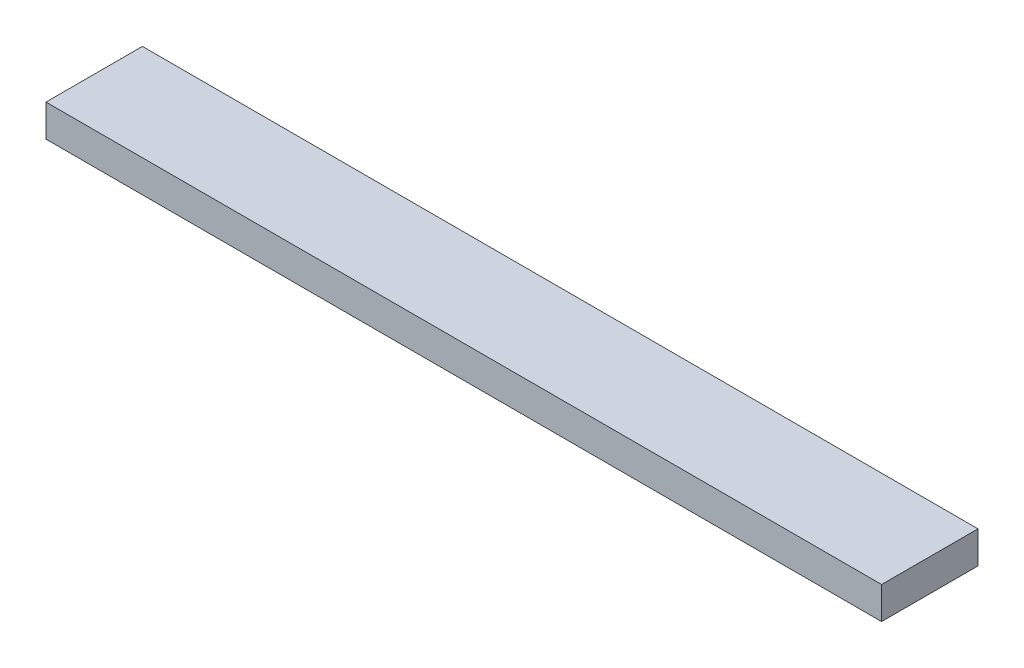
ISO-10303-21;
HEADER;
FILE_DESCRIPTION(('STEP AP214'),'2;1');
FILE_NAME('part.step','',(''),(''),'','','');
FILE_SCHEMA(('AUTOMOTIVE_DESIGN { 1 0 10303 214 1 1 1 1 }'));
ENDSEC;
DATA;
#1=APPLICATION_CONTEXT('core data for automotive mechanical design processes');
#2=APPLICATION_PROTOCOL_DEFINITION('international standard','automotive_design',2000,#1);
#3=PRODUCT_CONTEXT('',#1,'mechanical');
#4=PRODUCT('Part','Part','',(#3));
#5=PRODUCT_RELATED_PRODUCT_CATEGORY('part','',(#4));
#6=PRODUCT_DEFINITION_FORMATION('','',#4);
#7=PRODUCT_DEFINITION_CONTEXT('part definition',#1,'design');
#8=PRODUCT_DEFINITION('design','',#6,#7);
#9=PRODUCT_DEFINITION_SHAPE('','',#8);
#10=(LENGTH_UNIT() NAMED_UNIT(*) SI_UNIT(.MILLI.,.METRE.));
#11=(NAMED_UNIT(*) PLANE_ANGLE_UNIT() SI_UNIT($,.RADIAN.));
#12=(NAMED_UNIT(*) SI_UNIT($,.STERADIAN.) SOLID_ANGLE_UNIT());
#13=UNCERTAINTY_MEASURE_WITH_UNIT(LENGTH_MEASURE(1.E-05),#10,'distance_accuracy_value','');
#14=(GEOMETRIC_REPRESENTATION_CONTEXT(3) GLOBAL_UNCERTAINTY_ASSIGNED_CONTEXT((#13)) GLOBAL_UNIT_ASSIGNED_CONTEXT((#10,
#11,#12)) REPRESENTATION_CONTEXT('',''));
#15=CARTESIAN_POINT('',(0.,0.,0.));
#16=DIRECTION('',(0.,0.,1.));
#17=DIRECTION('',(1.,0.,0.));
#18=AXIS2_PLACEMENT_3D('',#15,#16,#17);
#19=CARTESIAN_POINT('',(0.,3.175,0.));
#20=DIRECTION('',(1.,0.,0.));
#21=DIRECTION('',(0.,0.,-1.));
#22=AXIS2_PLACEMENT_3D('',#19,#20,#21);
#23=PLANE('',#22);
#24=DIRECTION('',(0.,0.,1.));
#25=VECTOR('',#24,1.);
#26=CARTESIAN_POINT('',(0.,0.,0.));
#27=LINE('',#26,#25);
#28=CARTESIAN_POINT('',(0.,0.,-9.525));
#29=VERTEX_POINT('',#28);
#30=CARTESIAN_POINT('',(0.,0.,0.));
#31=VERTEX_POINT('',#30);
#32=EDGE_CURVE('E99',#29,#31,#27,.T.);
#33=ORIENTED_EDGE('',*,*,#32,.T.);
#34=DIRECTION('',(0.,-1.,0.));
#35=VECTOR('',#34,1.);
#36=CARTESIAN_POINT('',(0.,3.175,0.));
#37=LINE('',#36,#35);
#38=CARTESIAN_POINT('',(0.,3.175,0.));
#39=VERTEX_POINT('',#38);
#40=EDGE_CURVE('E11',#39,#31,#37,.T.);
#41=ORIENTED_EDGE('',*,*,#40,.F.);
#42=DIRECTION('',(0.,0.,1.));
#43=VECTOR('',#42,1.);
#44=CARTESIAN_POINT('',(0.,3.175,0.));
#45=LINE('',#44,#43);
#46=CARTESIAN_POINT('',(0.,3.175,-9.525));
#47=VERTEX_POINT('',#46);
#48=EDGE_CURVE('E87',#47,#39,#45,.T.);
#49=ORIENTED_EDGE('',*,*,#48,.F.);
#50=DIRECTION('',(0.,-1.,0.));
#51=VECTOR('',#50,1.);
#52=CARTESIAN_POINT('',(0.,3.175,-9.525));
#53=LINE('',#52,#51);
#54=EDGE_CURVE('E95',#47,#29,#53,.T.);
#55=ORIENTED_EDGE('',*,*,#54,.T.);
#56=EDGE_LOOP('',(#33,#41,#49,#55));
#57=FACE_BOUND('',#56,.T.);
#58=ADVANCED_FACE('F36',(#57),#23,.F.);
#59=CARTESIAN_POINT('',(0.,3.175,0.));
#60=DIRECTION('',(0.,0.,-1.));
#61=DIRECTION('',(-1.,0.,0.));
#62=AXIS2_PLACEMENT_3D('',#59,#60,#61);
#63=PLANE('',#62);
#64=DIRECTION('',(1.,0.,0.));
#65=VECTOR('',#64,1.);
#66=CARTESIAN_POINT('',(0.,0.,0.));
#67=LINE('',#66,#65);
#68=CARTESIAN_POINT('',(82.55,0.,0.));
#69=VERTEX_POINT('',#68);
#70=EDGE_CURVE('E91',#31,#69,#67,.T.);
#71=ORIENTED_EDGE('',*,*,#70,.T.);
#72=DIRECTION('',(0.,-1.,0.));
#73=VECTOR('',#72,1.);
#74=CARTESIAN_POINT('',(82.55,3.175,0.));
#75=LINE('',#74,#73);
#76=CARTESIAN_POINT('',(82.55,3.175,0.));
#77=VERTEX_POINT('',#76);
#78=EDGE_CURVE('E44',#77,#69,#75,.T.);
#79=ORIENTED_EDGE('',*,*,#78,.F.);
#80=DIRECTION('',(1.,0.,0.));
#81=VECTOR('',#80,1.);
#82=CARTESIAN_POINT('',(0.,3.175,0.));
#83=LINE('',#82,#81);
#84=EDGE_CURVE('E82',#39,#77,#83,.T.);
#85=ORIENTED_EDGE('',*,*,#84,.F.);
#86=ORIENTED_EDGE('',*,*,#40,.T.);
#87=EDGE_LOOP('',(#71,#79,#85,#86));
#88=FACE_BOUND('',#87,.T.);
#89=ADVANCED_FACE('F90',(#88),#63,.F.);
#90=CARTESIAN_POINT('',(82.55,3.175,0.));
#91=DIRECTION('',(-1.,0.,0.));
#92=DIRECTION('',(0.,0.,1.));
#93=AXIS2_PLACEMENT_3D('',#90,#91,#92);
#94=PLANE('',#93);
#95=DIRECTION('',(0.,0.,-1.));
#96=VECTOR('',#95,1.);
#97=CARTESIAN_POINT('',(82.55,0.,0.));
#98=LINE('',#97,#96);
#99=CARTESIAN_POINT('',(82.55,0.,-9.525));
#100=VERTEX_POINT('',#99);
#101=EDGE_CURVE('E69',#69,#100,#98,.T.);
#102=ORIENTED_EDGE('',*,*,#101,.T.);
#103=DIRECTION('',(0.,-1.,0.));
#104=VECTOR('',#103,1.);
#105=CARTESIAN_POINT('',(82.55,3.175,-9.525));
#106=LINE('',#105,#104);
#107=CARTESIAN_POINT('',(82.55,3.175,-9.525));
#108=VERTEX_POINT('',#107);
#109=EDGE_CURVE('E92',#108,#100,#106,.T.);
#110=ORIENTED_EDGE('',*,*,#109,.F.);
#111=DIRECTION('',(0.,0.,-1.));
#112=VECTOR('',#111,1.);
#113=CARTESIAN_POINT('',(82.55,3.175,0.));
#114=LINE('',#113,#112);
#115=EDGE_CURVE('E85',#77,#108,#114,.T.);
#116=ORIENTED_EDGE('',*,*,#115,.F.);
#117=ORIENTED_EDGE('',*,*,#78,.T.);
#118=EDGE_LOOP('',(#102,#110,#116,#117));
#119=FACE_BOUND('',#118,.T.);
#120=ADVANCED_FACE('F93',(#119),#94,.F.);
#121=CARTESIAN_POINT('',(0.,3.175,-9.525));
#122=DIRECTION('',(0.,0.,1.));
#123=DIRECTION('',(1.,0.,0.));
#124=AXIS2_PLACEMENT_3D('',#121,#122,#123);
#125=PLANE('',#124);
#126=DIRECTION('',(-1.,0.,0.));
#127=VECTOR('',#126,1.);
#128=CARTESIAN_POINT('',(0.,0.,-9.525));
#129=LINE('',#128,#127);
#130=EDGE_CURVE('E75',#100,#29,#129,.T.);
#131=ORIENTED_EDGE('',*,*,#130,.T.);
#132=ORIENTED_EDGE('',*,*,#54,.F.);
#133=DIRECTION('',(-1.,0.,0.));
#134=VECTOR('',#133,1.);
#135=CARTESIAN_POINT('',(0.,3.175,-9.525));
#136=LINE('',#135,#134);
#137=EDGE_CURVE('E52',#108,#47,#136,.T.);
#138=ORIENTED_EDGE('',*,*,#137,.F.);
#139=ORIENTED_EDGE('',*,*,#109,.T.);
#140=EDGE_LOOP('',(#131,#132,#138,#139));
#141=FACE_BOUND('',#140,.T.);
#142=ADVANCED_FACE('F106',(#141),#125,.F.);
#143=CARTESIAN_POINT('',(0.,3.175,0.));
#144=DIRECTION('',(0.,-1.,0.));
#145=DIRECTION('',(0.,0.,-1.));
#146=AXIS2_PLACEMENT_3D('',#143,#144,#145);
#147=PLANE('',#146);
#148=ORIENTED_EDGE('',*,*,#48,.T.);
#149=ORIENTED_EDGE('',*,*,#84,.T.);
#150=ORIENTED_EDGE('',*,*,#115,.T.);
#151=ORIENTED_EDGE('',*,*,#137,.T.);
#152=EDGE_LOOP('',(#148,#149,#150,#151));
#153=FACE_BOUND('',#152,.T.);
#154=ADVANCED_FACE('F83',(#153),#147,.F.);
#155=CARTESIAN_POINT('',(0.,0.,0.));
#156=DIRECTION('',(0.,-1.,0.));
#157=DIRECTION('',(0.,0.,-1.));
#158=AXIS2_PLACEMENT_3D('',#155,#156,#157);
#159=PLANE('',#158);
#160=ORIENTED_EDGE('',*,*,#32,.F.);
#161=ORIENTED_EDGE('',*,*,#130,.F.);
#162=ORIENTED_EDGE('',*,*,#101,.F.);
#163=ORIENTED_EDGE('',*,*,#70,.F.);
#164=EDGE_LOOP('',(#160,#161,#162,#163));
#165=FACE_BOUND('',#164,.T.);
#166=ADVANCED_FACE('F109',(#165),#159,.T.);
#167=CLOSED_SHELL('',(#58,#89,#120,#142,#154,#166));
#168=MANIFOLD_SOLID_BREP('B2',#167);
#169=ADVANCED_BREP_SHAPE_REPRESENTATION('',(#18,#168),#14);
#170=SHAPE_DEFINITION_REPRESENTATION(#9,#169);
ENDSEC;
END-ISO-10303-21;
